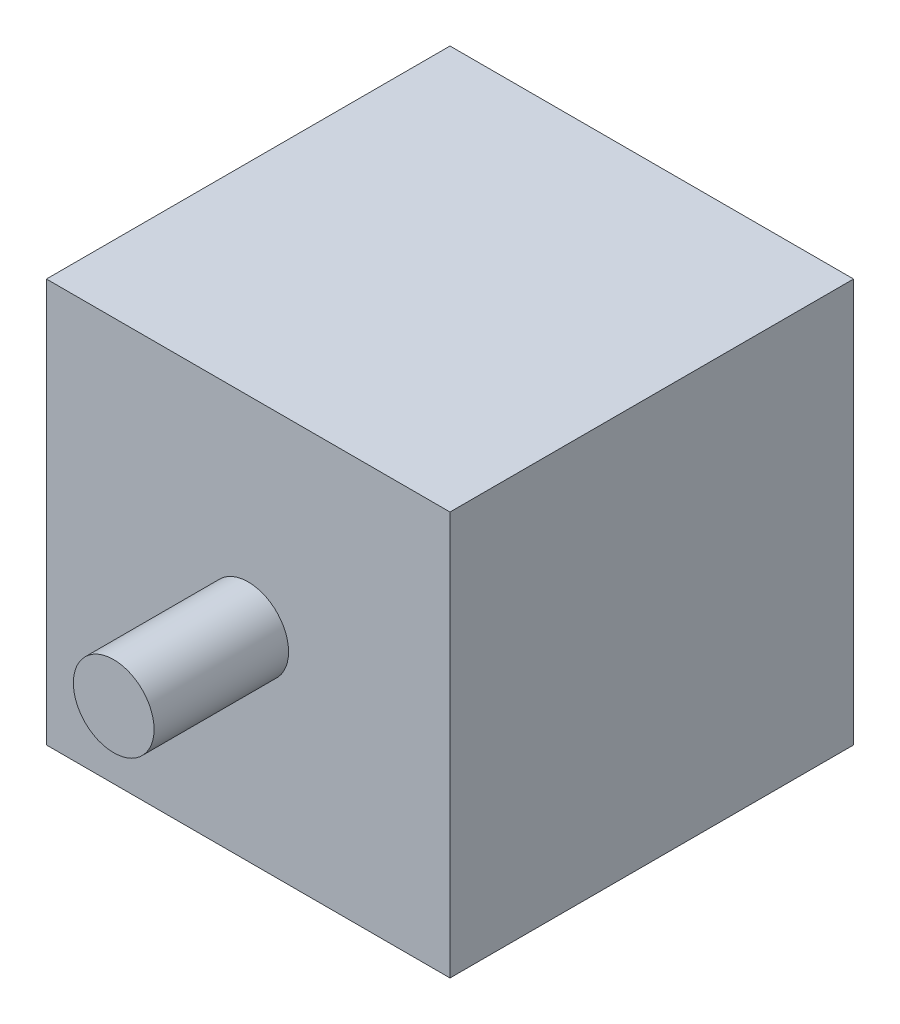
ISO-10303-21;
HEADER;
FILE_DESCRIPTION(('STEP AP214'),'2;1');
FILE_NAME('part.step','',(''),(''),'','','');
FILE_SCHEMA(('AUTOMOTIVE_DESIGN { 1 0 10303 214 1 1 1 1 }'));
ENDSEC;
DATA;
#1=APPLICATION_CONTEXT('core data for automotive mechanical design processes');
#2=APPLICATION_PROTOCOL_DEFINITION('international standard','automotive_design',2000,#1);
#3=PRODUCT_CONTEXT('',#1,'mechanical');
#4=PRODUCT('Part','Part','',(#3));
#5=PRODUCT_RELATED_PRODUCT_CATEGORY('part','',(#4));
#6=PRODUCT_DEFINITION_FORMATION('','',#4);
#7=PRODUCT_DEFINITION_CONTEXT('part definition',#1,'design');
#8=PRODUCT_DEFINITION('design','',#6,#7);
#9=PRODUCT_DEFINITION_SHAPE('','',#8);
#10=(LENGTH_UNIT() NAMED_UNIT(*) SI_UNIT(.MILLI.,.METRE.));
#11=(NAMED_UNIT(*) PLANE_ANGLE_UNIT() SI_UNIT($,.RADIAN.));
#12=(NAMED_UNIT(*) SI_UNIT($,.STERADIAN.) SOLID_ANGLE_UNIT());
#13=UNCERTAINTY_MEASURE_WITH_UNIT(LENGTH_MEASURE(1.E-05),#10,'distance_accuracy_value','');
#14=(GEOMETRIC_REPRESENTATION_CONTEXT(3) GLOBAL_UNCERTAINTY_ASSIGNED_CONTEXT((#13)) GLOBAL_UNIT_ASSIGNED_CONTEXT((#10,
#11,#12)) REPRESENTATION_CONTEXT('',''));
#15=CARTESIAN_POINT('',(0.,0.,0.));
#16=DIRECTION('',(0.,0.,1.));
#17=DIRECTION('',(1.,0.,0.));
#18=AXIS2_PLACEMENT_3D('',#15,#16,#17);
#19=CARTESIAN_POINT('',(7.5,7.50000000000001,15.));
#20=DIRECTION('',(-1.,0.,0.));
#21=DIRECTION('',(0.,0.,1.));
#22=AXIS2_PLACEMENT_3D('',#19,#20,#21);
#23=PLANE('',#22);
#24=DIRECTION('',(0.,1.,0.));
#25=VECTOR('',#24,1.);
#26=CARTESIAN_POINT('',(7.5,7.50000000000001,0.));
#27=LINE('',#26,#25);
#28=CARTESIAN_POINT('',(7.5,-7.49999999999999,0.));
#29=VERTEX_POINT('',#28);
#30=CARTESIAN_POINT('',(7.5,7.50000000000001,0.));
#31=VERTEX_POINT('',#30);
#32=EDGE_CURVE('E99',#29,#31,#27,.T.);
#33=ORIENTED_EDGE('',*,*,#32,.T.);
#34=DIRECTION('',(0.,0.,-1.));
#35=VECTOR('',#34,1.);
#36=CARTESIAN_POINT('',(7.5,7.50000000000001,15.));
#37=LINE('',#36,#35);
#38=CARTESIAN_POINT('',(7.5,7.50000000000001,15.));
#39=VERTEX_POINT('',#38);
#40=EDGE_CURVE('E11',#39,#31,#37,.T.);
#41=ORIENTED_EDGE('',*,*,#40,.F.);
#42=DIRECTION('',(0.,1.,0.));
#43=VECTOR('',#42,1.);
#44=CARTESIAN_POINT('',(7.5,7.50000000000001,15.));
#45=LINE('',#44,#43);
#46=CARTESIAN_POINT('',(7.5,-7.49999999999999,15.));
#47=VERTEX_POINT('',#46);
#48=EDGE_CURVE('E87',#47,#39,#45,.T.);
#49=ORIENTED_EDGE('',*,*,#48,.F.);
#50=DIRECTION('',(0.,0.,-1.));
#51=VECTOR('',#50,1.);
#52=CARTESIAN_POINT('',(7.5,-7.49999999999999,15.));
#53=LINE('',#52,#51);
#54=EDGE_CURVE('E95',#47,#29,#53,.T.);
#55=ORIENTED_EDGE('',*,*,#54,.T.);
#56=EDGE_LOOP('',(#33,#41,#49,#55));
#57=FACE_BOUND('',#56,.T.);
#58=ADVANCED_FACE('F36',(#57),#23,.F.);
#59=CARTESIAN_POINT('',(-7.5,7.50000000000001,15.));
#60=DIRECTION('',(0.,-1.,0.));
#61=DIRECTION('',(0.,0.,-1.));
#62=AXIS2_PLACEMENT_3D('',#59,#60,#61);
#63=PLANE('',#62);
#64=DIRECTION('',(-1.,0.,0.));
#65=VECTOR('',#64,1.);
#66=CARTESIAN_POINT('',(-7.5,7.50000000000001,0.));
#67=LINE('',#66,#65);
#68=CARTESIAN_POINT('',(-7.5,7.50000000000001,0.));
#69=VERTEX_POINT('',#68);
#70=EDGE_CURVE('E91',#31,#69,#67,.T.);
#71=ORIENTED_EDGE('',*,*,#70,.T.);
#72=DIRECTION('',(0.,0.,-1.));
#73=VECTOR('',#72,1.);
#74=CARTESIAN_POINT('',(-7.5,7.50000000000001,15.));
#75=LINE('',#74,#73);
#76=CARTESIAN_POINT('',(-7.5,7.50000000000001,15.));
#77=VERTEX_POINT('',#76);
#78=EDGE_CURVE('E44',#77,#69,#75,.T.);
#79=ORIENTED_EDGE('',*,*,#78,.F.);
#80=DIRECTION('',(-1.,0.,0.));
#81=VECTOR('',#80,1.);
#82=CARTESIAN_POINT('',(-7.5,7.50000000000001,15.));
#83=LINE('',#82,#81);
#84=EDGE_CURVE('E82',#39,#77,#83,.T.);
#85=ORIENTED_EDGE('',*,*,#84,.F.);
#86=ORIENTED_EDGE('',*,*,#40,.T.);
#87=EDGE_LOOP('',(#71,#79,#85,#86));
#88=FACE_BOUND('',#87,.T.);
#89=ADVANCED_FACE('F90',(#88),#63,.F.);
#90=CARTESIAN_POINT('',(-7.5,7.50000000000001,15.));
#91=DIRECTION('',(1.,0.,0.));
#92=DIRECTION('',(0.,0.,-1.));
#93=AXIS2_PLACEMENT_3D('',#90,#91,#92);
#94=PLANE('',#93);
#95=DIRECTION('',(0.,-1.,0.));
#96=VECTOR('',#95,1.);
#97=CARTESIAN_POINT('',(-7.5,7.50000000000001,0.));
#98=LINE('',#97,#96);
#99=CARTESIAN_POINT('',(-7.5,-7.49999999999999,0.));
#100=VERTEX_POINT('',#99);
#101=EDGE_CURVE('E69',#69,#100,#98,.T.);
#102=ORIENTED_EDGE('',*,*,#101,.T.);
#103=DIRECTION('',(0.,0.,-1.));
#104=VECTOR('',#103,1.);
#105=CARTESIAN_POINT('',(-7.5,-7.49999999999999,15.));
#106=LINE('',#105,#104);
#107=CARTESIAN_POINT('',(-7.5,-7.49999999999999,15.));
#108=VERTEX_POINT('',#107);
#109=EDGE_CURVE('E92',#108,#100,#106,.T.);
#110=ORIENTED_EDGE('',*,*,#109,.F.);
#111=DIRECTION('',(0.,-1.,0.));
#112=VECTOR('',#111,1.);
#113=CARTESIAN_POINT('',(-7.5,7.50000000000001,15.));
#114=LINE('',#113,#112);
#115=EDGE_CURVE('E85',#77,#108,#114,.T.);
#116=ORIENTED_EDGE('',*,*,#115,.F.);
#117=ORIENTED_EDGE('',*,*,#78,.T.);
#118=EDGE_LOOP('',(#102,#110,#116,#117));
#119=FACE_BOUND('',#118,.T.);
#120=ADVANCED_FACE('F93',(#119),#94,.F.);
#121=CARTESIAN_POINT('',(-7.5,-7.49999999999999,15.));
#122=DIRECTION('',(0.,1.,0.));
#123=DIRECTION('',(0.,0.,1.));
#124=AXIS2_PLACEMENT_3D('',#121,#122,#123);
#125=PLANE('',#124);
#126=DIRECTION('',(1.,0.,0.));
#127=VECTOR('',#126,1.);
#128=CARTESIAN_POINT('',(-7.5,-7.49999999999999,0.));
#129=LINE('',#128,#127);
#130=EDGE_CURVE('E75',#100,#29,#129,.T.);
#131=ORIENTED_EDGE('',*,*,#130,.T.);
#132=ORIENTED_EDGE('',*,*,#54,.F.);
#133=DIRECTION('',(1.,0.,0.));
#134=VECTOR('',#133,1.);
#135=CARTESIAN_POINT('',(-7.5,-7.49999999999999,15.));
#136=LINE('',#135,#134);
#137=EDGE_CURVE('E52',#108,#47,#136,.T.);
#138=ORIENTED_EDGE('',*,*,#137,.F.);
#139=ORIENTED_EDGE('',*,*,#109,.T.);
#140=EDGE_LOOP('',(#131,#132,#138,#139));
#141=FACE_BOUND('',#140,.T.);
#142=ADVANCED_FACE('F107',(#141),#125,.F.);
#143=CARTESIAN_POINT('',(0.,0.,15.));
#144=DIRECTION('',(0.,0.,1.));
#145=DIRECTION('',(1.,0.,0.));
#146=AXIS2_PLACEMENT_3D('',#143,#144,#145);
#147=PLANE('',#146);
#148=CARTESIAN_POINT('',(0.,0.,15.));
#149=DIRECTION('',(0.,0.,1.));
#150=DIRECTION('',(1.,0.,0.));
#151=AXIS2_PLACEMENT_3D('',#148,#149,#150);
#152=CIRCLE('',#151,1.5);
#153=CARTESIAN_POINT('',(1.5,0.,15.));
#154=VERTEX_POINT('',#153);
#155=EDGE_CURVE('E113',#154,#154,#152,.T.);
#156=ORIENTED_EDGE('',*,*,#155,.F.);
#157=EDGE_LOOP('',(#156));
#158=FACE_BOUND('',#157,.T.);
#159=ORIENTED_EDGE('',*,*,#48,.T.);
#160=ORIENTED_EDGE('',*,*,#84,.T.);
#161=ORIENTED_EDGE('',*,*,#115,.T.);
#162=ORIENTED_EDGE('',*,*,#137,.T.);
#163=EDGE_LOOP('',(#159,#160,#161,#162));
#164=FACE_BOUND('',#163,.T.);
#165=ADVANCED_FACE('F83',(#158,#164),#147,.T.);
#166=CARTESIAN_POINT('',(0.,0.,0.));
#167=DIRECTION('',(0.,0.,1.));
#168=DIRECTION('',(1.,0.,0.));
#169=AXIS2_PLACEMENT_3D('',#166,#167,#168);
#170=PLANE('',#169);
#171=ORIENTED_EDGE('',*,*,#32,.F.);
#172=ORIENTED_EDGE('',*,*,#130,.F.);
#173=ORIENTED_EDGE('',*,*,#101,.F.);
#174=ORIENTED_EDGE('',*,*,#70,.F.);
#175=EDGE_LOOP('',(#171,#172,#173,#174));
#176=FACE_BOUND('',#175,.T.);
#177=ADVANCED_FACE('F110',(#176),#170,.F.);
#178=CARTESIAN_POINT('',(0.,0.,20.));
#179=DIRECTION('',(0.,0.,-1.));
#180=DIRECTION('',(-1.,0.,0.));
#181=AXIS2_PLACEMENT_3D('',#178,#179,#180);
#182=CYLINDRICAL_SURFACE('',#181,1.5);
#183=CARTESIAN_POINT('',(0.,0.,20.));
#184=DIRECTION('',(0.,0.,1.));
#185=DIRECTION('',(1.,0.,0.));
#186=AXIS2_PLACEMENT_3D('',#183,#184,#185);
#187=CIRCLE('',#186,1.5);
#188=CARTESIAN_POINT('',(1.5,0.,20.));
#189=VERTEX_POINT('',#188);
#190=EDGE_CURVE('E102',#189,#189,#187,.T.);
#191=ORIENTED_EDGE('',*,*,#190,.F.);
#192=EDGE_LOOP('',(#191));
#193=FACE_BOUND('',#192,.T.);
#194=ORIENTED_EDGE('',*,*,#155,.T.);
#195=EDGE_LOOP('',(#194));
#196=FACE_BOUND('',#195,.T.);
#197=ADVANCED_FACE('F121',(#193,#196),#182,.T.);
#198=CARTESIAN_POINT('',(0.,0.,20.));
#199=DIRECTION('',(0.,0.,1.));
#200=DIRECTION('',(1.,0.,0.));
#201=AXIS2_PLACEMENT_3D('',#198,#199,#200);
#202=PLANE('',#201);
#203=ORIENTED_EDGE('',*,*,#190,.T.);
#204=EDGE_LOOP('',(#203));
#205=FACE_BOUND('',#204,.T.);
#206=ADVANCED_FACE('F119',(#205),#202,.T.);
#207=CLOSED_SHELL('',(#58,#89,#120,#142,#165,#177,#197,#206));
#208=MANIFOLD_SOLID_BREP('B2',#207);
#209=ADVANCED_BREP_SHAPE_REPRESENTATION('',(#18,#208),#14);
#210=SHAPE_DEFINITION_REPRESENTATION(#9,#209);
ENDSEC;
END-ISO-10303-21;
